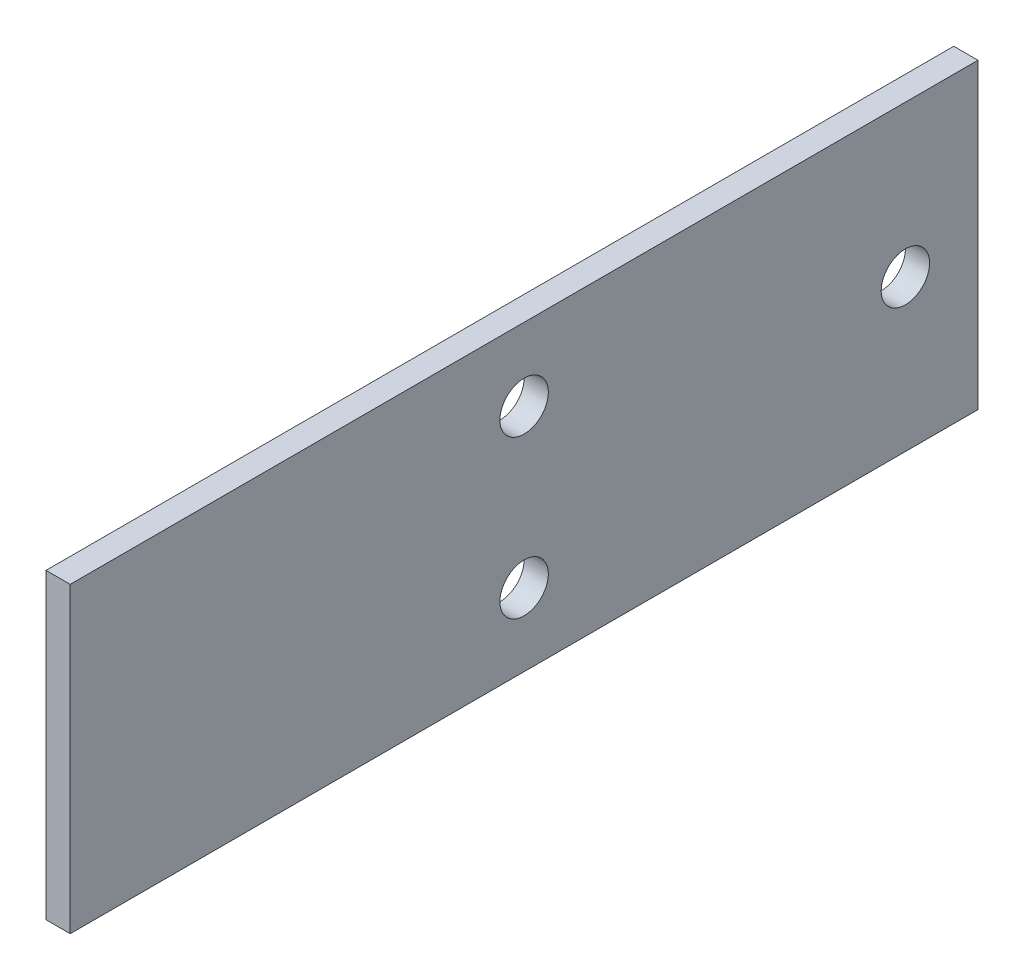
ISO-10303-21;
HEADER;
FILE_DESCRIPTION(('STEP AP214'),'2;1');
FILE_NAME('part.step','',(''),(''),'','','');
FILE_SCHEMA(('AUTOMOTIVE_DESIGN { 1 0 10303 214 1 1 1 1 }'));
ENDSEC;
DATA;
#1=APPLICATION_CONTEXT('core data for automotive mechanical design processes');
#2=APPLICATION_PROTOCOL_DEFINITION('international standard','automotive_design',2000,#1);
#3=PRODUCT_CONTEXT('',#1,'mechanical');
#4=PRODUCT('Part','Part','',(#3));
#5=PRODUCT_RELATED_PRODUCT_CATEGORY('part','',(#4));
#6=PRODUCT_DEFINITION_FORMATION('','',#4);
#7=PRODUCT_DEFINITION_CONTEXT('part definition',#1,'design');
#8=PRODUCT_DEFINITION('design','',#6,#7);
#9=PRODUCT_DEFINITION_SHAPE('','',#8);
#10=(LENGTH_UNIT() NAMED_UNIT(*) SI_UNIT(.MILLI.,.METRE.));
#11=(NAMED_UNIT(*) PLANE_ANGLE_UNIT() SI_UNIT($,.RADIAN.));
#12=(NAMED_UNIT(*) SI_UNIT($,.STERADIAN.) SOLID_ANGLE_UNIT());
#13=UNCERTAINTY_MEASURE_WITH_UNIT(LENGTH_MEASURE(1.E-05),#10,'distance_accuracy_value','');
#14=(GEOMETRIC_REPRESENTATION_CONTEXT(3) GLOBAL_UNCERTAINTY_ASSIGNED_CONTEXT((#13)) GLOBAL_UNIT_ASSIGNED_CONTEXT((#10,
#11,#12)) REPRESENTATION_CONTEXT('',''));
#15=CARTESIAN_POINT('',(0.,0.,0.));
#16=DIRECTION('',(0.,0.,1.));
#17=DIRECTION('',(1.,0.,0.));
#18=AXIS2_PLACEMENT_3D('',#15,#16,#17);
#19=CARTESIAN_POINT('',(-2.,50.,75.));
#20=DIRECTION('',(1.,0.,0.));
#21=DIRECTION('',(0.,0.,-1.));
#22=AXIS2_PLACEMENT_3D('',#19,#20,#21);
#23=PLANE('',#22);
#24=CARTESIAN_POINT('',(-2.,38.,0.));
#25=DIRECTION('',(-1.,0.,0.));
#26=DIRECTION('',(0.,0.,1.));
#27=AXIS2_PLACEMENT_3D('',#24,#25,#26);
#28=CIRCLE('',#27,4.);
#29=CARTESIAN_POINT('',(-2.,38.,4.));
#30=VERTEX_POINT('',#29);
#31=EDGE_CURVE('E113',#30,#30,#28,.T.);
#32=ORIENTED_EDGE('',*,*,#31,.F.);
#33=EDGE_LOOP('',(#32));
#34=FACE_BOUND('',#33,.T.);
#35=CARTESIAN_POINT('',(-2.,12.,0.));
#36=DIRECTION('',(-1.,0.,0.));
#37=DIRECTION('',(0.,0.,1.));
#38=AXIS2_PLACEMENT_3D('',#35,#36,#37);
#39=CIRCLE('',#38,4.);
#40=CARTESIAN_POINT('',(-2.,12.,4.));
#41=VERTEX_POINT('',#40);
#42=EDGE_CURVE('E143',#41,#41,#39,.T.);
#43=ORIENTED_EDGE('',*,*,#42,.F.);
#44=EDGE_LOOP('',(#43));
#45=FACE_BOUND('',#44,.T.);
#46=CARTESIAN_POINT('',(-2.,25.,-63.));
#47=DIRECTION('',(-1.,0.,0.));
#48=DIRECTION('',(0.,0.,1.));
#49=AXIS2_PLACEMENT_3D('',#46,#47,#48);
#50=CIRCLE('',#49,4.00000000000001);
#51=CARTESIAN_POINT('',(-2.,25.,-59.));
#52=VERTEX_POINT('',#51);
#53=EDGE_CURVE('E147',#52,#52,#50,.T.);
#54=ORIENTED_EDGE('',*,*,#53,.F.);
#55=EDGE_LOOP('',(#54));
#56=FACE_BOUND('',#55,.T.);
#57=DIRECTION('',(0.,0.,1.));
#58=VECTOR('',#57,1.);
#59=CARTESIAN_POINT('',(-2.,0.,75.));
#60=LINE('',#59,#58);
#61=CARTESIAN_POINT('',(-2.,0.,-75.));
#62=VERTEX_POINT('',#61);
#63=CARTESIAN_POINT('',(-2.,0.,75.));
#64=VERTEX_POINT('',#63);
#65=EDGE_CURVE('E102',#62,#64,#60,.T.);
#66=ORIENTED_EDGE('',*,*,#65,.T.);
#67=DIRECTION('',(0.,-1.,0.));
#68=VECTOR('',#67,1.);
#69=CARTESIAN_POINT('',(-2.,50.,75.));
#70=LINE('',#69,#68);
#71=CARTESIAN_POINT('',(-2.,50.,75.));
#72=VERTEX_POINT('',#71);
#73=EDGE_CURVE('E11',#72,#64,#70,.T.);
#74=ORIENTED_EDGE('',*,*,#73,.F.);
#75=DIRECTION('',(0.,0.,1.));
#76=VECTOR('',#75,1.);
#77=CARTESIAN_POINT('',(-2.,50.,75.));
#78=LINE('',#77,#76);
#79=CARTESIAN_POINT('',(-2.,50.,-75.));
#80=VERTEX_POINT('',#79);
#81=EDGE_CURVE('E89',#80,#72,#78,.T.);
#82=ORIENTED_EDGE('',*,*,#81,.F.);
#83=DIRECTION('',(0.,-1.,0.));
#84=VECTOR('',#83,1.);
#85=CARTESIAN_POINT('',(-2.,50.,-75.));
#86=LINE('',#85,#84);
#87=EDGE_CURVE('E98',#80,#62,#86,.T.);
#88=ORIENTED_EDGE('',*,*,#87,.T.);
#89=EDGE_LOOP('',(#66,#74,#82,#88));
#90=FACE_BOUND('',#89,.T.);
#91=ADVANCED_FACE('F36',(#34,#45,#56,#90),#23,.F.);
#92=CARTESIAN_POINT('',(2.,50.,75.));
#93=DIRECTION('',(0.,0.,-1.));
#94=DIRECTION('',(-1.,0.,0.));
#95=AXIS2_PLACEMENT_3D('',#92,#93,#94);
#96=PLANE('',#95);
#97=DIRECTION('',(1.,0.,0.));
#98=VECTOR('',#97,1.);
#99=CARTESIAN_POINT('',(2.,0.,75.));
#100=LINE('',#99,#98);
#101=CARTESIAN_POINT('',(2.,0.,75.));
#102=VERTEX_POINT('',#101);
#103=EDGE_CURVE('E93',#64,#102,#100,.T.);
#104=ORIENTED_EDGE('',*,*,#103,.T.);
#105=DIRECTION('',(0.,-1.,0.));
#106=VECTOR('',#105,1.);
#107=CARTESIAN_POINT('',(2.,50.,75.));
#108=LINE('',#107,#106);
#109=CARTESIAN_POINT('',(2.,50.,75.));
#110=VERTEX_POINT('',#109);
#111=EDGE_CURVE('E45',#110,#102,#108,.T.);
#112=ORIENTED_EDGE('',*,*,#111,.F.);
#113=DIRECTION('',(1.,0.,0.));
#114=VECTOR('',#113,1.);
#115=CARTESIAN_POINT('',(2.,50.,75.));
#116=LINE('',#115,#114);
#117=EDGE_CURVE('E84',#72,#110,#116,.T.);
#118=ORIENTED_EDGE('',*,*,#117,.F.);
#119=ORIENTED_EDGE('',*,*,#73,.T.);
#120=EDGE_LOOP('',(#104,#112,#118,#119));
#121=FACE_BOUND('',#120,.T.);
#122=ADVANCED_FACE('F92',(#121),#96,.F.);
#123=CARTESIAN_POINT('',(2.,50.,75.));
#124=DIRECTION('',(-1.,0.,0.));
#125=DIRECTION('',(0.,0.,1.));
#126=AXIS2_PLACEMENT_3D('',#123,#124,#125);
#127=PLANE('',#126);
#128=CARTESIAN_POINT('',(2.,38.,0.));
#129=DIRECTION('',(-1.,0.,0.));
#130=DIRECTION('',(0.,0.,1.));
#131=AXIS2_PLACEMENT_3D('',#128,#129,#130);
#132=CIRCLE('',#131,4.);
#133=CARTESIAN_POINT('',(2.,38.,4.));
#134=VERTEX_POINT('',#133);
#135=EDGE_CURVE('E39',#134,#134,#132,.T.);
#136=ORIENTED_EDGE('',*,*,#135,.T.);
#137=EDGE_LOOP('',(#136));
#138=FACE_BOUND('',#137,.T.);
#139=CARTESIAN_POINT('',(2.,12.,0.));
#140=DIRECTION('',(-1.,0.,0.));
#141=DIRECTION('',(0.,0.,1.));
#142=AXIS2_PLACEMENT_3D('',#139,#140,#141);
#143=CIRCLE('',#142,4.);
#144=CARTESIAN_POINT('',(2.,12.,4.));
#145=VERTEX_POINT('',#144);
#146=EDGE_CURVE('E112',#145,#145,#143,.T.);
#147=ORIENTED_EDGE('',*,*,#146,.T.);
#148=EDGE_LOOP('',(#147));
#149=FACE_BOUND('',#148,.T.);
#150=CARTESIAN_POINT('',(2.,25.,-63.));
#151=DIRECTION('',(-1.,0.,0.));
#152=DIRECTION('',(0.,0.,1.));
#153=AXIS2_PLACEMENT_3D('',#150,#151,#152);
#154=CIRCLE('',#153,4.00000000000001);
#155=CARTESIAN_POINT('',(2.,25.,-59.));
#156=VERTEX_POINT('',#155);
#157=EDGE_CURVE('E110',#156,#156,#154,.T.);
#158=ORIENTED_EDGE('',*,*,#157,.T.);
#159=EDGE_LOOP('',(#158));
#160=FACE_BOUND('',#159,.T.);
#161=DIRECTION('',(0.,0.,-1.));
#162=VECTOR('',#161,1.);
#163=CARTESIAN_POINT('',(2.,0.,75.));
#164=LINE('',#163,#162);
#165=CARTESIAN_POINT('',(2.,0.,-75.));
#166=VERTEX_POINT('',#165);
#167=EDGE_CURVE('E71',#102,#166,#164,.T.);
#168=ORIENTED_EDGE('',*,*,#167,.T.);
#169=DIRECTION('',(0.,-1.,0.));
#170=VECTOR('',#169,1.);
#171=CARTESIAN_POINT('',(2.,50.,-75.));
#172=LINE('',#171,#170);
#173=CARTESIAN_POINT('',(2.,50.,-75.));
#174=VERTEX_POINT('',#173);
#175=EDGE_CURVE('E94',#174,#166,#172,.T.);
#176=ORIENTED_EDGE('',*,*,#175,.F.);
#177=DIRECTION('',(0.,0.,-1.));
#178=VECTOR('',#177,1.);
#179=CARTESIAN_POINT('',(2.,50.,75.));
#180=LINE('',#179,#178);
#181=EDGE_CURVE('E87',#110,#174,#180,.T.);
#182=ORIENTED_EDGE('',*,*,#181,.F.);
#183=ORIENTED_EDGE('',*,*,#111,.T.);
#184=EDGE_LOOP('',(#168,#176,#182,#183));
#185=FACE_BOUND('',#184,.T.);
#186=ADVANCED_FACE('F96',(#138,#149,#160,#185),#127,.F.);
#187=CARTESIAN_POINT('',(2.,50.,-75.));
#188=DIRECTION('',(0.,0.,1.));
#189=DIRECTION('',(1.,0.,0.));
#190=AXIS2_PLACEMENT_3D('',#187,#188,#189);
#191=PLANE('',#190);
#192=DIRECTION('',(-1.,0.,0.));
#193=VECTOR('',#192,1.);
#194=CARTESIAN_POINT('',(2.,0.,-75.));
#195=LINE('',#194,#193);
#196=EDGE_CURVE('E77',#166,#62,#195,.T.);
#197=ORIENTED_EDGE('',*,*,#196,.T.);
#198=ORIENTED_EDGE('',*,*,#87,.F.);
#199=DIRECTION('',(-1.,0.,0.));
#200=VECTOR('',#199,1.);
#201=CARTESIAN_POINT('',(2.,50.,-75.));
#202=LINE('',#201,#200);
#203=EDGE_CURVE('E54',#174,#80,#202,.T.);
#204=ORIENTED_EDGE('',*,*,#203,.F.);
#205=ORIENTED_EDGE('',*,*,#175,.T.);
#206=EDGE_LOOP('',(#197,#198,#204,#205));
#207=FACE_BOUND('',#206,.T.);
#208=ADVANCED_FACE('F159',(#207),#191,.F.);
#209=CARTESIAN_POINT('',(0.,50.,0.));
#210=DIRECTION('',(0.,1.,0.));
#211=DIRECTION('',(0.,0.,1.));
#212=AXIS2_PLACEMENT_3D('',#209,#210,#211);
#213=PLANE('',#212);
#214=ORIENTED_EDGE('',*,*,#81,.T.);
#215=ORIENTED_EDGE('',*,*,#117,.T.);
#216=ORIENTED_EDGE('',*,*,#181,.T.);
#217=ORIENTED_EDGE('',*,*,#203,.T.);
#218=EDGE_LOOP('',(#214,#215,#216,#217));
#219=FACE_BOUND('',#218,.T.);
#220=ADVANCED_FACE('F85',(#219),#213,.T.);
#221=CARTESIAN_POINT('',(0.,0.,0.));
#222=DIRECTION('',(0.,1.,0.));
#223=DIRECTION('',(0.,0.,1.));
#224=AXIS2_PLACEMENT_3D('',#221,#222,#223);
#225=PLANE('',#224);
#226=ORIENTED_EDGE('',*,*,#65,.F.);
#227=ORIENTED_EDGE('',*,*,#196,.F.);
#228=ORIENTED_EDGE('',*,*,#167,.F.);
#229=ORIENTED_EDGE('',*,*,#103,.F.);
#230=EDGE_LOOP('',(#226,#227,#228,#229));
#231=FACE_BOUND('',#230,.T.);
#232=ADVANCED_FACE('F150',(#231),#225,.F.);
#233=CARTESIAN_POINT('',(8.,25.,-63.));
#234=DIRECTION('',(-1.,0.,0.));
#235=DIRECTION('',(0.,0.,1.));
#236=AXIS2_PLACEMENT_3D('',#233,#234,#235);
#237=CYLINDRICAL_SURFACE('',#236,4.00000000000001);
#238=ORIENTED_EDGE('',*,*,#53,.T.);
#239=EDGE_LOOP('',(#238));
#240=FACE_BOUND('',#239,.T.);
#241=ORIENTED_EDGE('',*,*,#157,.F.);
#242=EDGE_LOOP('',(#241));
#243=FACE_BOUND('',#242,.T.);
#244=ADVANCED_FACE('F129',(#240,#243),#237,.F.);
#245=CARTESIAN_POINT('',(8.,12.,0.));
#246=DIRECTION('',(-1.,0.,0.));
#247=DIRECTION('',(0.,0.,1.));
#248=AXIS2_PLACEMENT_3D('',#245,#246,#247);
#249=CYLINDRICAL_SURFACE('',#248,4.);
#250=ORIENTED_EDGE('',*,*,#42,.T.);
#251=EDGE_LOOP('',(#250));
#252=FACE_BOUND('',#251,.T.);
#253=ORIENTED_EDGE('',*,*,#146,.F.);
#254=EDGE_LOOP('',(#253));
#255=FACE_BOUND('',#254,.T.);
#256=ADVANCED_FACE('F123',(#252,#255),#249,.F.);
#257=CARTESIAN_POINT('',(8.,38.,0.));
#258=DIRECTION('',(-1.,0.,0.));
#259=DIRECTION('',(0.,0.,1.));
#260=AXIS2_PLACEMENT_3D('',#257,#258,#259);
#261=CYLINDRICAL_SURFACE('',#260,4.);
#262=ORIENTED_EDGE('',*,*,#31,.T.);
#263=EDGE_LOOP('',(#262));
#264=FACE_BOUND('',#263,.T.);
#265=ORIENTED_EDGE('',*,*,#135,.F.);
#266=EDGE_LOOP('',(#265));
#267=FACE_BOUND('',#266,.T.);
#268=ADVANCED_FACE('F121',(#264,#267),#261,.F.);
#269=CLOSED_SHELL('',(#91,#122,#186,#208,#220,#232,#244,#256,#268));
#270=MANIFOLD_SOLID_BREP('B2',#269);
#271=ADVANCED_BREP_SHAPE_REPRESENTATION('',(#18,#270),#14);
#272=SHAPE_DEFINITION_REPRESENTATION(#9,#271);
ENDSEC;
END-ISO-10303-21;
